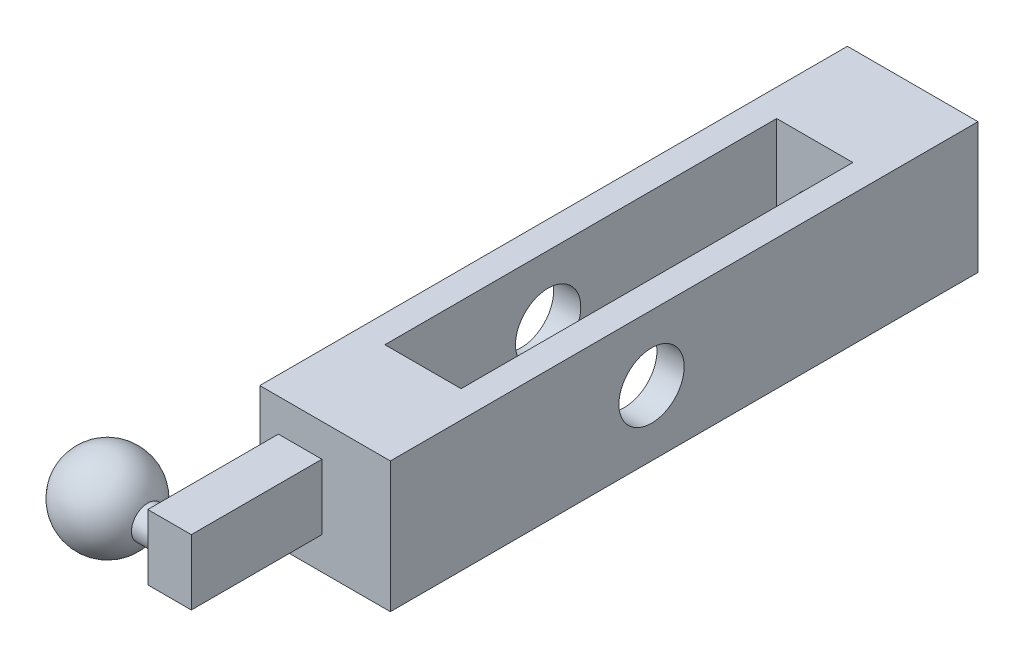
ISO-10303-21;
HEADER;
FILE_DESCRIPTION(('STEP AP214'),'2;1');
FILE_NAME('part.step','',(''),(''),'','','');
FILE_SCHEMA(('AUTOMOTIVE_DESIGN { 1 0 10303 214 1 1 1 1 }'));
ENDSEC;
DATA;
#1=APPLICATION_CONTEXT('core data for automotive mechanical design processes');
#2=APPLICATION_PROTOCOL_DEFINITION('international standard','automotive_design',2000,#1);
#3=PRODUCT_CONTEXT('',#1,'mechanical');
#4=PRODUCT('Part','Part','',(#3));
#5=PRODUCT_RELATED_PRODUCT_CATEGORY('part','',(#4));
#6=PRODUCT_DEFINITION_FORMATION('','',#4);
#7=PRODUCT_DEFINITION_CONTEXT('part definition',#1,'design');
#8=PRODUCT_DEFINITION('design','',#6,#7);
#9=PRODUCT_DEFINITION_SHAPE('','',#8);
#10=(LENGTH_UNIT() NAMED_UNIT(*) SI_UNIT(.MILLI.,.METRE.));
#11=(NAMED_UNIT(*) PLANE_ANGLE_UNIT() SI_UNIT($,.RADIAN.));
#12=(NAMED_UNIT(*) SI_UNIT($,.STERADIAN.) SOLID_ANGLE_UNIT());
#13=UNCERTAINTY_MEASURE_WITH_UNIT(LENGTH_MEASURE(1.E-05),#10,'distance_accuracy_value','');
#14=(GEOMETRIC_REPRESENTATION_CONTEXT(3) GLOBAL_UNCERTAINTY_ASSIGNED_CONTEXT((#13)) GLOBAL_UNIT_ASSIGNED_CONTEXT((#10,
#11,#12)) REPRESENTATION_CONTEXT('',''));
#15=CARTESIAN_POINT('',(0.,0.,0.));
#16=DIRECTION('',(0.,0.,1.));
#17=DIRECTION('',(1.,0.,0.));
#18=AXIS2_PLACEMENT_3D('',#15,#16,#17);
#19=CARTESIAN_POINT('',(3.,-3.,27.));
#20=DIRECTION('',(0.,1.,0.));
#21=DIRECTION('',(-1.,0.,0.));
#22=AXIS2_PLACEMENT_3D('',#19,#20,#21);
#23=PLANE('',#22);
#24=DIRECTION('',(1.,0.,0.));
#25=VECTOR('',#24,1.);
#26=CARTESIAN_POINT('',(3.,-3.,0.));
#27=LINE('',#26,#25);
#28=CARTESIAN_POINT('',(-3.,-3.,0.));
#29=VERTEX_POINT('',#28);
#30=CARTESIAN_POINT('',(3.,-3.,0.));
#31=VERTEX_POINT('',#30);
#32=EDGE_CURVE('E218',#29,#31,#27,.T.);
#33=ORIENTED_EDGE('',*,*,#32,.T.);
#34=DIRECTION('',(0.,0.,-1.));
#35=VECTOR('',#34,1.);
#36=CARTESIAN_POINT('',(3.,-3.,27.));
#37=LINE('',#36,#35);
#38=CARTESIAN_POINT('',(3.,-3.,27.));
#39=VERTEX_POINT('',#38);
#40=EDGE_CURVE('E228',#39,#31,#37,.T.);
#41=ORIENTED_EDGE('',*,*,#40,.F.);
#42=DIRECTION('',(1.,0.,0.));
#43=VECTOR('',#42,1.);
#44=CARTESIAN_POINT('',(3.,-3.,27.));
#45=LINE('',#44,#43);
#46=CARTESIAN_POINT('',(-3.,-3.,27.));
#47=VERTEX_POINT('',#46);
#48=EDGE_CURVE('E208',#47,#39,#45,.T.);
#49=ORIENTED_EDGE('',*,*,#48,.F.);
#50=DIRECTION('',(0.,0.,-1.));
#51=VECTOR('',#50,1.);
#52=CARTESIAN_POINT('',(-3.,-3.,27.));
#53=LINE('',#52,#51);
#54=EDGE_CURVE('E50',#47,#29,#53,.T.);
#55=ORIENTED_EDGE('',*,*,#54,.T.);
#56=EDGE_LOOP('',(#33,#41,#49,#55));
#57=FACE_BOUND('',#56,.T.);
#58=DIRECTION('',(1.,0.,0.));
#59=VECTOR('',#58,1.);
#60=CARTESIAN_POINT('',(3.,-3.,4.5));
#61=LINE('',#60,#59);
#62=CARTESIAN_POINT('',(-1.75,-3.,4.5));
#63=VERTEX_POINT('',#62);
#64=CARTESIAN_POINT('',(1.75,-3.,4.5));
#65=VERTEX_POINT('',#64);
#66=EDGE_CURVE('E135',#63,#65,#61,.T.);
#67=ORIENTED_EDGE('',*,*,#66,.F.);
#68=DIRECTION('',(0.,0.,-1.));
#69=VECTOR('',#68,1.);
#70=CARTESIAN_POINT('',(-1.75000000000001,-3.,27.));
#71=LINE('',#70,#69);
#72=CARTESIAN_POINT('',(-1.75000000000001,-3.,22.5));
#73=VERTEX_POINT('',#72);
#74=EDGE_CURVE('E138',#73,#63,#71,.T.);
#75=ORIENTED_EDGE('',*,*,#74,.F.);
#76=DIRECTION('',(-1.,0.,0.));
#77=VECTOR('',#76,1.);
#78=CARTESIAN_POINT('',(3.,-3.,22.5));
#79=LINE('',#78,#77);
#80=CARTESIAN_POINT('',(1.75,-3.,22.5));
#81=VERTEX_POINT('',#80);
#82=EDGE_CURVE('E167',#81,#73,#79,.T.);
#83=ORIENTED_EDGE('',*,*,#82,.F.);
#84=DIRECTION('',(0.,0.,1.));
#85=VECTOR('',#84,1.);
#86=CARTESIAN_POINT('',(1.74999999999999,-3.,27.));
#87=LINE('',#86,#85);
#88=EDGE_CURVE('E169',#65,#81,#87,.T.);
#89=ORIENTED_EDGE('',*,*,#88,.F.);
#90=EDGE_LOOP('',(#67,#75,#83,#89));
#91=FACE_BOUND('',#90,.T.);
#92=ADVANCED_FACE('F41',(#57,#91),#23,.F.);
#93=CARTESIAN_POINT('',(3.,3.,27.));
#94=DIRECTION('',(0.,-1.,0.));
#95=DIRECTION('',(1.,0.,0.));
#96=AXIS2_PLACEMENT_3D('',#93,#94,#95);
#97=PLANE('',#96);
#98=DIRECTION('',(-1.,0.,0.));
#99=VECTOR('',#98,1.);
#100=CARTESIAN_POINT('',(3.,3.,0.));
#101=LINE('',#100,#99);
#102=CARTESIAN_POINT('',(3.,3.,0.));
#103=VERTEX_POINT('',#102);
#104=CARTESIAN_POINT('',(-3.,3.,0.));
#105=VERTEX_POINT('',#104);
#106=EDGE_CURVE('E209',#103,#105,#101,.T.);
#107=ORIENTED_EDGE('',*,*,#106,.T.);
#108=DIRECTION('',(0.,0.,-1.));
#109=VECTOR('',#108,1.);
#110=CARTESIAN_POINT('',(-3.,3.,27.));
#111=LINE('',#110,#109);
#112=CARTESIAN_POINT('',(-3.,3.,27.));
#113=VERTEX_POINT('',#112);
#114=EDGE_CURVE('E215',#113,#105,#111,.T.);
#115=ORIENTED_EDGE('',*,*,#114,.F.);
#116=DIRECTION('',(-1.,0.,0.));
#117=VECTOR('',#116,1.);
#118=CARTESIAN_POINT('',(3.,3.,27.));
#119=LINE('',#118,#117);
#120=CARTESIAN_POINT('',(3.,3.,27.));
#121=VERTEX_POINT('',#120);
#122=EDGE_CURVE('E213',#121,#113,#119,.T.);
#123=ORIENTED_EDGE('',*,*,#122,.F.);
#124=DIRECTION('',(0.,0.,-1.));
#125=VECTOR('',#124,1.);
#126=CARTESIAN_POINT('',(3.,3.,27.));
#127=LINE('',#126,#125);
#128=EDGE_CURVE('E225',#121,#103,#127,.T.);
#129=ORIENTED_EDGE('',*,*,#128,.T.);
#130=EDGE_LOOP('',(#107,#115,#123,#129));
#131=FACE_BOUND('',#130,.T.);
#132=DIRECTION('',(1.,0.,0.));
#133=VECTOR('',#132,1.);
#134=CARTESIAN_POINT('',(-1.75,3.,4.5));
#135=LINE('',#134,#133);
#136=CARTESIAN_POINT('',(-1.75,3.,4.5));
#137=VERTEX_POINT('',#136);
#138=CARTESIAN_POINT('',(1.75,3.,4.5));
#139=VERTEX_POINT('',#138);
#140=EDGE_CURVE('E66',#137,#139,#135,.T.);
#141=ORIENTED_EDGE('',*,*,#140,.T.);
#142=DIRECTION('',(0.,0.,1.));
#143=VECTOR('',#142,1.);
#144=CARTESIAN_POINT('',(1.75,3.,4.5));
#145=LINE('',#144,#143);
#146=CARTESIAN_POINT('',(1.75,3.,22.5));
#147=VERTEX_POINT('',#146);
#148=EDGE_CURVE('E142',#139,#147,#145,.T.);
#149=ORIENTED_EDGE('',*,*,#148,.T.);
#150=DIRECTION('',(-1.,0.,0.));
#151=VECTOR('',#150,1.);
#152=CARTESIAN_POINT('',(-1.75,3.,22.5));
#153=LINE('',#152,#151);
#154=CARTESIAN_POINT('',(-1.75,3.,22.5));
#155=VERTEX_POINT('',#154);
#156=EDGE_CURVE('E148',#147,#155,#153,.T.);
#157=ORIENTED_EDGE('',*,*,#156,.T.);
#158=DIRECTION('',(0.,0.,-1.));
#159=VECTOR('',#158,1.);
#160=CARTESIAN_POINT('',(-1.75,3.,4.5));
#161=LINE('',#160,#159);
#162=EDGE_CURVE('E152',#155,#137,#161,.T.);
#163=ORIENTED_EDGE('',*,*,#162,.T.);
#164=EDGE_LOOP('',(#141,#149,#157,#163));
#165=FACE_BOUND('',#164,.T.);
#166=ADVANCED_FACE('F151',(#131,#165),#97,.F.);
#167=CARTESIAN_POINT('',(0.,0.,27.));
#168=DIRECTION('',(0.,0.,1.));
#169=DIRECTION('',(1.,0.,0.));
#170=AXIS2_PLACEMENT_3D('',#167,#168,#169);
#171=PLANE('',#170);
#172=DIRECTION('',(0.,-1.,0.));
#173=VECTOR('',#172,1.);
#174=CARTESIAN_POINT('',(-3.,-3.,27.));
#175=LINE('',#174,#173);
#176=EDGE_CURVE('E205',#113,#47,#175,.T.);
#177=ORIENTED_EDGE('',*,*,#176,.T.);
#178=ORIENTED_EDGE('',*,*,#48,.T.);
#179=DIRECTION('',(0.,1.,0.));
#180=VECTOR('',#179,1.);
#181=CARTESIAN_POINT('',(3.,-3.,27.));
#182=LINE('',#181,#180);
#183=EDGE_CURVE('E211',#39,#121,#182,.T.);
#184=ORIENTED_EDGE('',*,*,#183,.T.);
#185=ORIENTED_EDGE('',*,*,#122,.T.);
#186=EDGE_LOOP('',(#177,#178,#184,#185));
#187=FACE_BOUND('',#186,.T.);
#188=DIRECTION('',(-1.,0.,0.));
#189=VECTOR('',#188,1.);
#190=CARTESIAN_POINT('',(-2.14479354998716,1.49545918544692,27.));
#191=LINE('',#190,#189);
#192=CARTESIAN_POINT('',(-0.144793549987163,1.49545918544692,27.));
#193=VERTEX_POINT('',#192);
#194=CARTESIAN_POINT('',(-2.14479354998716,1.49545918544692,27.));
#195=VERTEX_POINT('',#194);
#196=EDGE_CURVE('E189',#193,#195,#191,.T.);
#197=ORIENTED_EDGE('',*,*,#196,.F.);
#198=DIRECTION('',(0.,1.,0.));
#199=VECTOR('',#198,1.);
#200=CARTESIAN_POINT('',(-0.144793549987163,1.49545918544692,27.));
#201=LINE('',#200,#199);
#202=CARTESIAN_POINT('',(-0.144793549987163,-1.50454081455308,27.));
#203=VERTEX_POINT('',#202);
#204=EDGE_CURVE('E175',#203,#193,#201,.T.);
#205=ORIENTED_EDGE('',*,*,#204,.F.);
#206=DIRECTION('',(1.,0.,0.));
#207=VECTOR('',#206,1.);
#208=CARTESIAN_POINT('',(-2.14479354998716,-1.50454081455308,27.));
#209=LINE('',#208,#207);
#210=CARTESIAN_POINT('',(-2.14479354998716,-1.50454081455308,27.));
#211=VERTEX_POINT('',#210);
#212=EDGE_CURVE('E180',#211,#203,#209,.T.);
#213=ORIENTED_EDGE('',*,*,#212,.F.);
#214=DIRECTION('',(0.,-1.,0.));
#215=VECTOR('',#214,1.);
#216=CARTESIAN_POINT('',(-2.14479354998716,1.49545918544692,27.));
#217=LINE('',#216,#215);
#218=EDGE_CURVE('E191',#195,#211,#217,.T.);
#219=ORIENTED_EDGE('',*,*,#218,.F.);
#220=EDGE_LOOP('',(#197,#205,#213,#219));
#221=FACE_BOUND('',#220,.T.);
#222=ADVANCED_FACE('F272',(#187,#221),#171,.T.);
#223=CARTESIAN_POINT('',(-3.,-3.,27.));
#224=DIRECTION('',(1.,0.,0.));
#225=DIRECTION('',(0.,0.,-1.));
#226=AXIS2_PLACEMENT_3D('',#223,#224,#225);
#227=PLANE('',#226);
#228=CARTESIAN_POINT('',(-3.,0.,15.));
#229=DIRECTION('',(-1.,0.,0.));
#230=DIRECTION('',(0.,0.,1.));
#231=AXIS2_PLACEMENT_3D('',#228,#229,#230);
#232=CIRCLE('',#231,1.5);
#233=CARTESIAN_POINT('',(-3.,0.,16.5));
#234=VERTEX_POINT('',#233);
#235=EDGE_CURVE('E234',#234,#234,#232,.T.);
#236=ORIENTED_EDGE('',*,*,#235,.F.);
#237=EDGE_LOOP('',(#236));
#238=FACE_BOUND('',#237,.T.);
#239=DIRECTION('',(0.,-1.,0.));
#240=VECTOR('',#239,1.);
#241=CARTESIAN_POINT('',(-3.,-3.,0.));
#242=LINE('',#241,#240);
#243=EDGE_CURVE('E204',#105,#29,#242,.T.);
#244=ORIENTED_EDGE('',*,*,#243,.T.);
#245=ORIENTED_EDGE('',*,*,#54,.F.);
#246=ORIENTED_EDGE('',*,*,#176,.F.);
#247=ORIENTED_EDGE('',*,*,#114,.T.);
#248=EDGE_LOOP('',(#244,#245,#246,#247));
#249=FACE_BOUND('',#248,.T.);
#250=ADVANCED_FACE('F43',(#238,#249),#227,.F.);
#251=CARTESIAN_POINT('',(3.,-3.,27.));
#252=DIRECTION('',(-1.,0.,0.));
#253=DIRECTION('',(0.,0.,1.));
#254=AXIS2_PLACEMENT_3D('',#251,#252,#253);
#255=PLANE('',#254);
#256=CARTESIAN_POINT('',(3.,0.,15.));
#257=DIRECTION('',(-1.,0.,0.));
#258=DIRECTION('',(0.,0.,1.));
#259=AXIS2_PLACEMENT_3D('',#256,#257,#258);
#260=CIRCLE('',#259,1.5);
#261=CARTESIAN_POINT('',(3.,0.,16.5));
#262=VERTEX_POINT('',#261);
#263=EDGE_CURVE('E153',#262,#262,#260,.T.);
#264=ORIENTED_EDGE('',*,*,#263,.T.);
#265=EDGE_LOOP('',(#264));
#266=FACE_BOUND('',#265,.T.);
#267=DIRECTION('',(0.,1.,0.));
#268=VECTOR('',#267,1.);
#269=CARTESIAN_POINT('',(3.,-3.,0.));
#270=LINE('',#269,#268);
#271=EDGE_CURVE('E220',#31,#103,#270,.T.);
#272=ORIENTED_EDGE('',*,*,#271,.T.);
#273=ORIENTED_EDGE('',*,*,#128,.F.);
#274=ORIENTED_EDGE('',*,*,#183,.F.);
#275=ORIENTED_EDGE('',*,*,#40,.T.);
#276=EDGE_LOOP('',(#272,#273,#274,#275));
#277=FACE_BOUND('',#276,.T.);
#278=ADVANCED_FACE('F254',(#266,#277),#255,.F.);
#279=CARTESIAN_POINT('',(0.,0.,0.));
#280=DIRECTION('',(0.,0.,1.));
#281=DIRECTION('',(1.,0.,0.));
#282=AXIS2_PLACEMENT_3D('',#279,#280,#281);
#283=PLANE('',#282);
#284=CARTESIAN_POINT('',(0.,0.,0.));
#285=DIRECTION('',(0.,0.,-1.));
#286=DIRECTION('',(-1.,0.,0.));
#287=AXIS2_PLACEMENT_3D('',#284,#285,#286);
#288=CIRCLE('',#287,0.9);
#289=CARTESIAN_POINT('',(-0.9,0.,0.));
#290=VERTEX_POINT('',#289);
#291=EDGE_CURVE('E243',#290,#290,#288,.T.);
#292=ORIENTED_EDGE('',*,*,#291,.F.);
#293=EDGE_LOOP('',(#292));
#294=FACE_BOUND('',#293,.T.);
#295=ORIENTED_EDGE('',*,*,#243,.F.);
#296=ORIENTED_EDGE('',*,*,#106,.F.);
#297=ORIENTED_EDGE('',*,*,#271,.F.);
#298=ORIENTED_EDGE('',*,*,#32,.F.);
#299=EDGE_LOOP('',(#295,#296,#297,#298));
#300=FACE_BOUND('',#299,.T.);
#301=ADVANCED_FACE('F250',(#294,#300),#283,.F.);
#302=CARTESIAN_POINT('',(-0.144793549987163,1.49545918544692,33.));
#303=DIRECTION('',(-1.,0.,0.));
#304=DIRECTION('',(0.,-1.,0.));
#305=AXIS2_PLACEMENT_3D('',#302,#303,#304);
#306=PLANE('',#305);
#307=ORIENTED_EDGE('',*,*,#204,.T.);
#308=DIRECTION('',(0.,0.,-1.));
#309=VECTOR('',#308,1.);
#310=CARTESIAN_POINT('',(-0.144793549987163,1.49545918544692,33.));
#311=LINE('',#310,#309);
#312=CARTESIAN_POINT('',(-0.144793549987163,1.49545918544692,33.));
#313=VERTEX_POINT('',#312);
#314=EDGE_CURVE('E202',#313,#193,#311,.T.);
#315=ORIENTED_EDGE('',*,*,#314,.F.);
#316=DIRECTION('',(0.,1.,0.));
#317=VECTOR('',#316,1.);
#318=CARTESIAN_POINT('',(-0.144793549987163,1.49545918544692,33.));
#319=LINE('',#318,#317);
#320=CARTESIAN_POINT('',(-0.144793549987163,-1.50454081455308,33.));
#321=VERTEX_POINT('',#320);
#322=EDGE_CURVE('E176',#321,#313,#319,.T.);
#323=ORIENTED_EDGE('',*,*,#322,.F.);
#324=DIRECTION('',(0.,0.,-1.));
#325=VECTOR('',#324,1.);
#326=CARTESIAN_POINT('',(-0.144793549987163,-1.50454081455308,33.));
#327=LINE('',#326,#325);
#328=EDGE_CURVE('E186',#321,#203,#327,.T.);
#329=ORIENTED_EDGE('',*,*,#328,.T.);
#330=EDGE_LOOP('',(#307,#315,#323,#329));
#331=FACE_BOUND('',#330,.T.);
#332=ADVANCED_FACE('F253',(#331),#306,.F.);
#333=CARTESIAN_POINT('',(-2.14479354998716,1.49545918544692,33.));
#334=DIRECTION('',(0.,-1.,0.));
#335=DIRECTION('',(1.,0.,0.));
#336=AXIS2_PLACEMENT_3D('',#333,#334,#335);
#337=PLANE('',#336);
#338=ORIENTED_EDGE('',*,*,#196,.T.);
#339=DIRECTION('',(0.,0.,-1.));
#340=VECTOR('',#339,1.);
#341=CARTESIAN_POINT('',(-2.14479354998716,1.49545918544692,33.));
#342=LINE('',#341,#340);
#343=CARTESIAN_POINT('',(-2.14479354998716,1.49545918544692,33.));
#344=VERTEX_POINT('',#343);
#345=EDGE_CURVE('E199',#344,#195,#342,.T.);
#346=ORIENTED_EDGE('',*,*,#345,.F.);
#347=DIRECTION('',(-1.,0.,0.));
#348=VECTOR('',#347,1.);
#349=CARTESIAN_POINT('',(-2.14479354998716,1.49545918544692,33.));
#350=LINE('',#349,#348);
#351=EDGE_CURVE('E179',#313,#344,#350,.T.);
#352=ORIENTED_EDGE('',*,*,#351,.F.);
#353=ORIENTED_EDGE('',*,*,#314,.T.);
#354=EDGE_LOOP('',(#338,#346,#352,#353));
#355=FACE_BOUND('',#354,.T.);
#356=ADVANCED_FACE('F282',(#355),#337,.F.);
#357=CARTESIAN_POINT('',(-2.14479354998716,1.49545918544692,33.));
#358=DIRECTION('',(1.,0.,0.));
#359=DIRECTION('',(0.,1.,0.));
#360=AXIS2_PLACEMENT_3D('',#357,#358,#359);
#361=PLANE('',#360);
#362=CARTESIAN_POINT('',(-2.14479354998716,0.,32.));
#363=DIRECTION('',(1.,0.,0.));
#364=DIRECTION('',(0.,1.,0.));
#365=AXIS2_PLACEMENT_3D('',#362,#363,#364);
#366=CIRCLE('',#365,0.749999999999999);
#367=CARTESIAN_POINT('',(-2.14479354998716,0.749999999999998,32.));
#368=VERTEX_POINT('',#367);
#369=EDGE_CURVE('E11',#368,#368,#366,.F.);
#370=ORIENTED_EDGE('',*,*,#369,.F.);
#371=EDGE_LOOP('',(#370));
#372=FACE_BOUND('',#371,.T.);
#373=ORIENTED_EDGE('',*,*,#218,.T.);
#374=DIRECTION('',(0.,0.,-1.));
#375=VECTOR('',#374,1.);
#376=CARTESIAN_POINT('',(-2.14479354998716,-1.50454081455308,33.));
#377=LINE('',#376,#375);
#378=CARTESIAN_POINT('',(-2.14479354998716,-1.50454081455308,33.));
#379=VERTEX_POINT('',#378);
#380=EDGE_CURVE('E197',#379,#211,#377,.T.);
#381=ORIENTED_EDGE('',*,*,#380,.F.);
#382=DIRECTION('',(0.,-1.,0.));
#383=VECTOR('',#382,1.);
#384=CARTESIAN_POINT('',(-2.14479354998716,1.49545918544692,33.));
#385=LINE('',#384,#383);
#386=EDGE_CURVE('E182',#344,#379,#385,.T.);
#387=ORIENTED_EDGE('',*,*,#386,.F.);
#388=ORIENTED_EDGE('',*,*,#345,.T.);
#389=EDGE_LOOP('',(#373,#381,#387,#388));
#390=FACE_BOUND('',#389,.T.);
#391=ADVANCED_FACE('F286',(#372,#390),#361,.F.);
#392=CARTESIAN_POINT('',(-2.14479354998716,-1.50454081455308,33.));
#393=DIRECTION('',(0.,1.,0.));
#394=DIRECTION('',(-1.,0.,0.));
#395=AXIS2_PLACEMENT_3D('',#392,#393,#394);
#396=PLANE('',#395);
#397=ORIENTED_EDGE('',*,*,#212,.T.);
#398=ORIENTED_EDGE('',*,*,#328,.F.);
#399=DIRECTION('',(1.,0.,0.));
#400=VECTOR('',#399,1.);
#401=CARTESIAN_POINT('',(-2.14479354998716,-1.50454081455308,33.));
#402=LINE('',#401,#400);
#403=EDGE_CURVE('E184',#379,#321,#402,.T.);
#404=ORIENTED_EDGE('',*,*,#403,.F.);
#405=ORIENTED_EDGE('',*,*,#380,.T.);
#406=EDGE_LOOP('',(#397,#398,#404,#405));
#407=FACE_BOUND('',#406,.T.);
#408=ADVANCED_FACE('F295',(#407),#396,.F.);
#409=CARTESIAN_POINT('',(0.,0.,33.));
#410=DIRECTION('',(0.,0.,1.));
#411=DIRECTION('',(1.,0.,0.));
#412=AXIS2_PLACEMENT_3D('',#409,#410,#411);
#413=PLANE('',#412);
#414=ORIENTED_EDGE('',*,*,#322,.T.);
#415=ORIENTED_EDGE('',*,*,#351,.T.);
#416=ORIENTED_EDGE('',*,*,#386,.T.);
#417=ORIENTED_EDGE('',*,*,#403,.T.);
#418=EDGE_LOOP('',(#414,#415,#416,#417));
#419=FACE_BOUND('',#418,.T.);
#420=ADVANCED_FACE('F290',(#419),#413,.T.);
#421=CARTESIAN_POINT('',(-3.14479354998716,0.,32.));
#422=DIRECTION('',(1.,0.,0.));
#423=DIRECTION('',(0.,1.,0.));
#424=AXIS2_PLACEMENT_3D('',#421,#422,#423);
#425=CYLINDRICAL_SURFACE('',#424,0.749999999999999);
#426=CARTESIAN_POINT('',(-3.14479354998716,0.,32.));
#427=DIRECTION('',(-1.,0.,0.));
#428=DIRECTION('',(0.,-1.,0.));
#429=AXIS2_PLACEMENT_3D('',#426,#427,#428);
#430=CIRCLE('',#429,0.749999999999999);
#431=CARTESIAN_POINT('',(-3.14479354998716,-0.749999999999999,32.));
#432=VERTEX_POINT('',#431);
#433=EDGE_CURVE('E172',#432,#432,#430,.T.);
#434=ORIENTED_EDGE('',*,*,#433,.F.);
#435=EDGE_LOOP('',(#434));
#436=FACE_BOUND('',#435,.T.);
#437=ORIENTED_EDGE('',*,*,#369,.T.);
#438=EDGE_LOOP('',(#437));
#439=FACE_BOUND('',#438,.T.);
#440=ADVANCED_FACE('F302',(#436,#439),#425,.T.);
#441=CARTESIAN_POINT('',(-4.99884317176108,0.,32.));
#442=DIRECTION('',(1.,0.,0.));
#443=DIRECTION('',(0.,0.,-1.));
#444=AXIS2_PLACEMENT_3D('',#441,#442,#443);
#445=SPHERICAL_SURFACE('',#444,2.);
#446=ORIENTED_EDGE('',*,*,#433,.T.);
#447=EDGE_LOOP('',(#446));
#448=FACE_BOUND('',#447,.T.);
#449=ADVANCED_FACE('F360',(#448),#445,.T.);
#450=CARTESIAN_POINT('',(-1.75,-5.,4.5));
#451=DIRECTION('',(0.,0.,1.));
#452=DIRECTION('',(1.,0.,0.));
#453=AXIS2_PLACEMENT_3D('',#450,#451,#452);
#454=PLANE('',#453);
#455=CARTESIAN_POINT('',(0.,0.,4.5));
#456=DIRECTION('',(0.,0.,1.));
#457=DIRECTION('',(1.,0.,0.));
#458=AXIS2_PLACEMENT_3D('',#455,#456,#457);
#459=CIRCLE('',#458,0.9);
#460=CARTESIAN_POINT('',(0.9,0.,4.5));
#461=VERTEX_POINT('',#460);
#462=EDGE_CURVE('E45',#461,#461,#459,.T.);
#463=ORIENTED_EDGE('',*,*,#462,.F.);
#464=EDGE_LOOP('',(#463));
#465=FACE_BOUND('',#464,.T.);
#466=ORIENTED_EDGE('',*,*,#66,.T.);
#467=DIRECTION('',(0.,1.,0.));
#468=VECTOR('',#467,1.);
#469=CARTESIAN_POINT('',(1.75,-5.,4.5));
#470=LINE('',#469,#468);
#471=EDGE_CURVE('E131',#65,#139,#470,.T.);
#472=ORIENTED_EDGE('',*,*,#471,.T.);
#473=ORIENTED_EDGE('',*,*,#140,.F.);
#474=DIRECTION('',(0.,1.,0.));
#475=VECTOR('',#474,1.);
#476=CARTESIAN_POINT('',(-1.75,-5.,4.5));
#477=LINE('',#476,#475);
#478=EDGE_CURVE('E162',#63,#137,#477,.T.);
#479=ORIENTED_EDGE('',*,*,#478,.F.);
#480=EDGE_LOOP('',(#466,#472,#473,#479));
#481=FACE_BOUND('',#480,.T.);
#482=ADVANCED_FACE('F133',(#465,#481),#454,.T.);
#483=CARTESIAN_POINT('',(1.75,-5.,4.5));
#484=DIRECTION('',(-1.,0.,0.));
#485=DIRECTION('',(0.,-1.,0.));
#486=AXIS2_PLACEMENT_3D('',#483,#484,#485);
#487=PLANE('',#486);
#488=CARTESIAN_POINT('',(1.75,0.,15.));
#489=DIRECTION('',(-1.,0.,0.));
#490=DIRECTION('',(0.,-1.,0.));
#491=AXIS2_PLACEMENT_3D('',#488,#489,#490);
#492=CIRCLE('',#491,1.5);
#493=CARTESIAN_POINT('',(1.75,-1.5,15.));
#494=VERTEX_POINT('',#493);
#495=EDGE_CURVE('E156',#494,#494,#492,.T.);
#496=ORIENTED_EDGE('',*,*,#495,.F.);
#497=EDGE_LOOP('',(#496));
#498=FACE_BOUND('',#497,.T.);
#499=ORIENTED_EDGE('',*,*,#88,.T.);
#500=DIRECTION('',(0.,1.,0.));
#501=VECTOR('',#500,1.);
#502=CARTESIAN_POINT('',(1.74999999999999,-5.,22.5));
#503=LINE('',#502,#501);
#504=EDGE_CURVE('E139',#81,#147,#503,.T.);
#505=ORIENTED_EDGE('',*,*,#504,.T.);
#506=ORIENTED_EDGE('',*,*,#148,.F.);
#507=ORIENTED_EDGE('',*,*,#471,.F.);
#508=EDGE_LOOP('',(#499,#505,#506,#507));
#509=FACE_BOUND('',#508,.T.);
#510=ADVANCED_FACE('F143',(#498,#509),#487,.T.);
#511=CARTESIAN_POINT('',(-1.75000000000001,-5.,22.5));
#512=DIRECTION('',(0.,0.,-1.));
#513=DIRECTION('',(-1.,0.,0.));
#514=AXIS2_PLACEMENT_3D('',#511,#512,#513);
#515=PLANE('',#514);
#516=ORIENTED_EDGE('',*,*,#82,.T.);
#517=DIRECTION('',(0.,1.,0.));
#518=VECTOR('',#517,1.);
#519=CARTESIAN_POINT('',(-1.75000000000001,-5.,22.5));
#520=LINE('',#519,#518);
#521=EDGE_CURVE('E58',#73,#155,#520,.T.);
#522=ORIENTED_EDGE('',*,*,#521,.T.);
#523=ORIENTED_EDGE('',*,*,#156,.F.);
#524=ORIENTED_EDGE('',*,*,#504,.F.);
#525=EDGE_LOOP('',(#516,#522,#523,#524));
#526=FACE_BOUND('',#525,.T.);
#527=ADVANCED_FACE('F395',(#526),#515,.T.);
#528=CARTESIAN_POINT('',(-1.75,-5.,4.5));
#529=DIRECTION('',(1.,0.,0.));
#530=DIRECTION('',(0.,1.,0.));
#531=AXIS2_PLACEMENT_3D('',#528,#529,#530);
#532=PLANE('',#531);
#533=CARTESIAN_POINT('',(-1.75,0.,15.));
#534=DIRECTION('',(1.,0.,0.));
#535=DIRECTION('',(0.,1.,0.));
#536=AXIS2_PLACEMENT_3D('',#533,#534,#535);
#537=CIRCLE('',#536,1.5);
#538=CARTESIAN_POINT('',(-1.75,1.5,15.));
#539=VERTEX_POINT('',#538);
#540=EDGE_CURVE('E232',#539,#539,#537,.T.);
#541=ORIENTED_EDGE('',*,*,#540,.F.);
#542=EDGE_LOOP('',(#541));
#543=FACE_BOUND('',#542,.T.);
#544=ORIENTED_EDGE('',*,*,#74,.T.);
#545=ORIENTED_EDGE('',*,*,#478,.T.);
#546=ORIENTED_EDGE('',*,*,#162,.F.);
#547=ORIENTED_EDGE('',*,*,#521,.F.);
#548=EDGE_LOOP('',(#544,#545,#546,#547));
#549=FACE_BOUND('',#548,.T.);
#550=ADVANCED_FACE('F403',(#543,#549),#532,.T.);
#551=CARTESIAN_POINT('',(5.,0.,15.));
#552=DIRECTION('',(-1.,0.,0.));
#553=DIRECTION('',(0.,0.,1.));
#554=AXIS2_PLACEMENT_3D('',#551,#552,#553);
#555=CYLINDRICAL_SURFACE('',#554,1.5);
#556=ORIENTED_EDGE('',*,*,#540,.T.);
#557=EDGE_LOOP('',(#556));
#558=FACE_BOUND('',#557,.T.);
#559=ORIENTED_EDGE('',*,*,#235,.T.);
#560=EDGE_LOOP('',(#559));
#561=FACE_BOUND('',#560,.T.);
#562=ADVANCED_FACE('F412',(#558,#561),#555,.F.);
#563=ORIENTED_EDGE('',*,*,#495,.T.);
#564=EDGE_LOOP('',(#563));
#565=FACE_BOUND('',#564,.T.);
#566=ORIENTED_EDGE('',*,*,#263,.F.);
#567=EDGE_LOOP('',(#566));
#568=FACE_BOUND('',#567,.T.);
#569=ADVANCED_FACE('F421',(#565,#568),#555,.F.);
#570=CARTESIAN_POINT('',(0.,0.,8.));
#571=DIRECTION('',(0.,0.,-1.));
#572=DIRECTION('',(-1.,0.,0.));
#573=AXIS2_PLACEMENT_3D('',#570,#571,#572);
#574=CYLINDRICAL_SURFACE('',#573,0.9);
#575=ORIENTED_EDGE('',*,*,#462,.T.);
#576=EDGE_LOOP('',(#575));
#577=FACE_BOUND('',#576,.T.);
#578=ORIENTED_EDGE('',*,*,#291,.T.);
#579=EDGE_LOOP('',(#578));
#580=FACE_BOUND('',#579,.T.);
#581=ADVANCED_FACE('F248',(#577,#580),#574,.F.);
#582=CLOSED_SHELL('',(#92,#166,#222,#250,#278,#301,#332,#356,#391,#408,#420,#440,#449,#482,#510,
#527,#550,#562,#569,#581));
#583=MANIFOLD_SOLID_BREP('B2',#582);
#584=ADVANCED_BREP_SHAPE_REPRESENTATION('',(#18,#583),#14);
#585=SHAPE_DEFINITION_REPRESENTATION(#9,#584);
ENDSEC;
END-ISO-10303-21;
